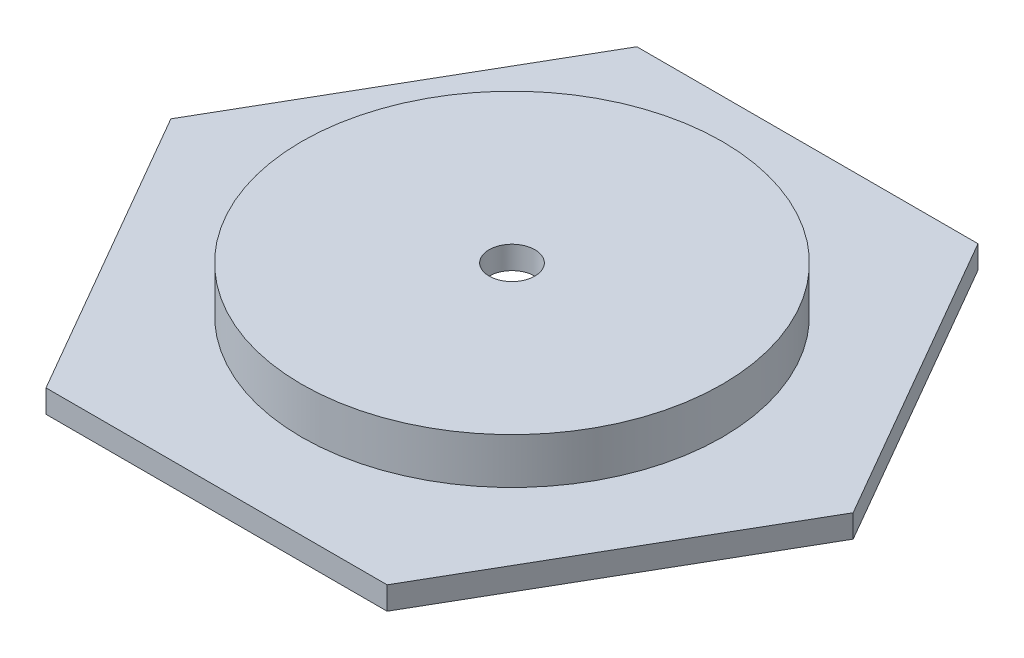
ISO-10303-21;
HEADER;
FILE_DESCRIPTION(('STEP AP214'),'2;1');
FILE_NAME('part.step','',(''),(''),'','','');
FILE_SCHEMA(('AUTOMOTIVE_DESIGN { 1 0 10303 214 1 1 1 1 }'));
ENDSEC;
DATA;
#1=APPLICATION_CONTEXT('core data for automotive mechanical design processes');
#2=APPLICATION_PROTOCOL_DEFINITION('international standard','automotive_design',2000,#1);
#3=PRODUCT_CONTEXT('',#1,'mechanical');
#4=PRODUCT('Part','Part','',(#3));
#5=PRODUCT_RELATED_PRODUCT_CATEGORY('part','',(#4));
#6=PRODUCT_DEFINITION_FORMATION('','',#4);
#7=PRODUCT_DEFINITION_CONTEXT('part definition',#1,'design');
#8=PRODUCT_DEFINITION('design','',#6,#7);
#9=PRODUCT_DEFINITION_SHAPE('','',#8);
#10=(LENGTH_UNIT() NAMED_UNIT(*) SI_UNIT(.MILLI.,.METRE.));
#11=(NAMED_UNIT(*) PLANE_ANGLE_UNIT() SI_UNIT($,.RADIAN.));
#12=(NAMED_UNIT(*) SI_UNIT($,.STERADIAN.) SOLID_ANGLE_UNIT());
#13=UNCERTAINTY_MEASURE_WITH_UNIT(LENGTH_MEASURE(1.E-05),#10,'distance_accuracy_value','');
#14=(GEOMETRIC_REPRESENTATION_CONTEXT(3) GLOBAL_UNCERTAINTY_ASSIGNED_CONTEXT((#13)) GLOBAL_UNIT_ASSIGNED_CONTEXT((#10,
#11,#12)) REPRESENTATION_CONTEXT('',''));
#15=CARTESIAN_POINT('',(0.,0.,0.));
#16=DIRECTION('',(0.,0.,1.));
#17=DIRECTION('',(1.,0.,0.));
#18=AXIS2_PLACEMENT_3D('',#15,#16,#17);
#19=CARTESIAN_POINT('',(18.6250000000003,2.5,32.2594462909701));
#20=DIRECTION('',(-0.866025403784442,0.,-0.499999999999995));
#21=DIRECTION('',(-0.499999999999995,0.,0.866025403784442));
#22=AXIS2_PLACEMENT_3D('',#19,#20,#21);
#23=PLANE('',#22);
#24=DIRECTION('',(0.499999999999995,0.,-0.866025403784442));
#25=VECTOR('',#24,1.);
#26=CARTESIAN_POINT('',(18.6250000000003,0.,32.2594462909701));
#27=LINE('',#26,#25);
#28=CARTESIAN_POINT('',(18.6250000000003,0.,32.2594462909701));
#29=VERTEX_POINT('',#28);
#30=CARTESIAN_POINT('',(37.2499999999999,0.,0.));
#31=VERTEX_POINT('',#30);
#32=EDGE_CURVE('E125',#29,#31,#27,.T.);
#33=ORIENTED_EDGE('',*,*,#32,.T.);
#34=DIRECTION('',(0.,-1.,0.));
#35=VECTOR('',#34,1.);
#36=CARTESIAN_POINT('',(37.2499999999999,2.5,0.));
#37=LINE('',#36,#35);
#38=CARTESIAN_POINT('',(37.2499999999999,2.5,0.));
#39=VERTEX_POINT('',#38);
#40=EDGE_CURVE('E42',#39,#31,#37,.T.);
#41=ORIENTED_EDGE('',*,*,#40,.F.);
#42=DIRECTION('',(0.499999999999995,0.,-0.866025403784442));
#43=VECTOR('',#42,1.);
#44=CARTESIAN_POINT('',(18.6250000000003,2.5,32.2594462909701));
#45=LINE('',#44,#43);
#46=CARTESIAN_POINT('',(18.6250000000003,2.5,32.2594462909701));
#47=VERTEX_POINT('',#46);
#48=EDGE_CURVE('E136',#47,#39,#45,.T.);
#49=ORIENTED_EDGE('',*,*,#48,.F.);
#50=DIRECTION('',(0.,-1.,0.));
#51=VECTOR('',#50,1.);
#52=CARTESIAN_POINT('',(18.6250000000003,2.5,32.2594462909701));
#53=LINE('',#52,#51);
#54=EDGE_CURVE('E121',#47,#29,#53,.T.);
#55=ORIENTED_EDGE('',*,*,#54,.T.);
#56=EDGE_LOOP('',(#33,#41,#49,#55));
#57=FACE_BOUND('',#56,.T.);
#58=ADVANCED_FACE('F39',(#57),#23,.F.);
#59=CARTESIAN_POINT('',(37.2499999999999,2.5,0.));
#60=DIRECTION('',(-0.866025403784438,0.,0.500000000000001));
#61=DIRECTION('',(0.500000000000001,0.,0.866025403784438));
#62=AXIS2_PLACEMENT_3D('',#59,#60,#61);
#63=PLANE('',#62);
#64=DIRECTION('',(-0.500000000000001,0.,-0.866025403784438));
#65=VECTOR('',#64,1.);
#66=CARTESIAN_POINT('',(37.2499999999999,0.,0.));
#67=LINE('',#66,#65);
#68=CARTESIAN_POINT('',(18.6249999999999,0.,-32.2594462909703));
#69=VERTEX_POINT('',#68);
#70=EDGE_CURVE('E128',#31,#69,#67,.T.);
#71=ORIENTED_EDGE('',*,*,#70,.T.);
#72=DIRECTION('',(0.,-1.,0.));
#73=VECTOR('',#72,1.);
#74=CARTESIAN_POINT('',(18.6249999999999,2.5,-32.2594462909703));
#75=LINE('',#74,#73);
#76=CARTESIAN_POINT('',(18.6249999999999,2.5,-32.2594462909703));
#77=VERTEX_POINT('',#76);
#78=EDGE_CURVE('E139',#77,#69,#75,.T.);
#79=ORIENTED_EDGE('',*,*,#78,.F.);
#80=DIRECTION('',(-0.500000000000001,0.,-0.866025403784438));
#81=VECTOR('',#80,1.);
#82=CARTESIAN_POINT('',(37.2499999999999,2.5,0.));
#83=LINE('',#82,#81);
#84=EDGE_CURVE('E94',#39,#77,#83,.T.);
#85=ORIENTED_EDGE('',*,*,#84,.F.);
#86=ORIENTED_EDGE('',*,*,#40,.T.);
#87=EDGE_LOOP('',(#71,#79,#85,#86));
#88=FACE_BOUND('',#87,.T.);
#89=ADVANCED_FACE('F144',(#88),#63,.F.);
#90=CARTESIAN_POINT('',(18.6249999999999,2.5,-32.2594462909703));
#91=DIRECTION('',(0.,0.,1.));
#92=DIRECTION('',(1.,0.,0.));
#93=AXIS2_PLACEMENT_3D('',#90,#91,#92);
#94=PLANE('',#93);
#95=DIRECTION('',(-1.,0.,0.));
#96=VECTOR('',#95,1.);
#97=CARTESIAN_POINT('',(18.6249999999999,0.,-32.2594462909703));
#98=LINE('',#97,#96);
#99=CARTESIAN_POINT('',(-18.6250000000001,0.,-32.2594462909702));
#100=VERTEX_POINT('',#99);
#101=EDGE_CURVE('E131',#69,#100,#98,.T.);
#102=ORIENTED_EDGE('',*,*,#101,.T.);
#103=DIRECTION('',(0.,-1.,0.));
#104=VECTOR('',#103,1.);
#105=CARTESIAN_POINT('',(-18.6250000000001,2.5,-32.2594462909702));
#106=LINE('',#105,#104);
#107=CARTESIAN_POINT('',(-18.6250000000001,2.5,-32.2594462909702));
#108=VERTEX_POINT('',#107);
#109=EDGE_CURVE('E116',#108,#100,#106,.T.);
#110=ORIENTED_EDGE('',*,*,#109,.F.);
#111=DIRECTION('',(-1.,0.,0.));
#112=VECTOR('',#111,1.);
#113=CARTESIAN_POINT('',(18.6249999999999,2.5,-32.2594462909703));
#114=LINE('',#113,#112);
#115=EDGE_CURVE('E107',#77,#108,#114,.T.);
#116=ORIENTED_EDGE('',*,*,#115,.F.);
#117=ORIENTED_EDGE('',*,*,#78,.T.);
#118=EDGE_LOOP('',(#102,#110,#116,#117));
#119=FACE_BOUND('',#118,.T.);
#120=ADVANCED_FACE('F150',(#119),#94,.F.);
#121=CARTESIAN_POINT('',(-18.6250000000001,2.5,-32.2594462909702));
#122=DIRECTION('',(0.866025403784442,0.,0.499999999999995));
#123=DIRECTION('',(0.499999999999995,0.,-0.866025403784442));
#124=AXIS2_PLACEMENT_3D('',#121,#122,#123);
#125=PLANE('',#124);
#126=DIRECTION('',(-0.499999999999995,0.,0.866025403784441));
#127=VECTOR('',#126,1.);
#128=CARTESIAN_POINT('',(-18.6250000000001,0.,-32.2594462909702));
#129=LINE('',#128,#127);
#130=CARTESIAN_POINT('',(-37.2499999999999,0.,2.60115359743813E-13));
#131=VERTEX_POINT('',#130);
#132=EDGE_CURVE('E115',#100,#131,#129,.T.);
#133=ORIENTED_EDGE('',*,*,#132,.T.);
#134=DIRECTION('',(0.,-1.,0.));
#135=VECTOR('',#134,1.);
#136=CARTESIAN_POINT('',(-37.2499999999999,2.5,2.60115359743813E-13));
#137=LINE('',#136,#135);
#138=CARTESIAN_POINT('',(-37.2499999999999,2.5,2.60115359743813E-13));
#139=VERTEX_POINT('',#138);
#140=EDGE_CURVE('E112',#139,#131,#137,.T.);
#141=ORIENTED_EDGE('',*,*,#140,.F.);
#142=DIRECTION('',(-0.499999999999995,0.,0.866025403784441));
#143=VECTOR('',#142,1.);
#144=CARTESIAN_POINT('',(-18.6250000000001,2.5,-32.2594462909702));
#145=LINE('',#144,#143);
#146=EDGE_CURVE('E101',#108,#139,#145,.T.);
#147=ORIENTED_EDGE('',*,*,#146,.F.);
#148=ORIENTED_EDGE('',*,*,#109,.T.);
#149=EDGE_LOOP('',(#133,#141,#147,#148));
#150=FACE_BOUND('',#149,.T.);
#151=ADVANCED_FACE('F113',(#150),#125,.F.);
#152=CARTESIAN_POINT('',(-37.2499999999999,2.5,2.60115359743813E-13));
#153=DIRECTION('',(0.866025403784434,0.,-0.500000000000007));
#154=DIRECTION('',(-0.500000000000007,0.,-0.866025403784435));
#155=AXIS2_PLACEMENT_3D('',#152,#153,#154);
#156=PLANE('',#155);
#157=DIRECTION('',(0.500000000000007,0.,0.866025403784434));
#158=VECTOR('',#157,1.);
#159=CARTESIAN_POINT('',(-37.2499999999999,0.,2.60115359743813E-13));
#160=LINE('',#159,#158);
#161=CARTESIAN_POINT('',(-18.6249999999997,0.,32.2594462909704));
#162=VERTEX_POINT('',#161);
#163=EDGE_CURVE('E79',#131,#162,#160,.T.);
#164=ORIENTED_EDGE('',*,*,#163,.T.);
#165=DIRECTION('',(0.,-1.,0.));
#166=VECTOR('',#165,1.);
#167=CARTESIAN_POINT('',(-18.6249999999997,2.5,32.2594462909704));
#168=LINE('',#167,#166);
#169=CARTESIAN_POINT('',(-18.6249999999997,2.5,32.2594462909704));
#170=VERTEX_POINT('',#169);
#171=EDGE_CURVE('E117',#170,#162,#168,.T.);
#172=ORIENTED_EDGE('',*,*,#171,.F.);
#173=DIRECTION('',(0.500000000000007,0.,0.866025403784434));
#174=VECTOR('',#173,1.);
#175=CARTESIAN_POINT('',(-37.2499999999999,2.5,2.60115359743813E-13));
#176=LINE('',#175,#174);
#177=EDGE_CURVE('E105',#139,#170,#176,.T.);
#178=ORIENTED_EDGE('',*,*,#177,.F.);
#179=ORIENTED_EDGE('',*,*,#140,.T.);
#180=EDGE_LOOP('',(#164,#172,#178,#179));
#181=FACE_BOUND('',#180,.T.);
#182=ADVANCED_FACE('F119',(#181),#156,.F.);
#183=CARTESIAN_POINT('',(-18.6249999999997,2.5,32.2594462909704));
#184=DIRECTION('',(0.,0.,-1.));
#185=DIRECTION('',(-1.,0.,0.));
#186=AXIS2_PLACEMENT_3D('',#183,#184,#185);
#187=PLANE('',#186);
#188=DIRECTION('',(1.,0.,0.));
#189=VECTOR('',#188,1.);
#190=CARTESIAN_POINT('',(-18.6249999999997,0.,32.2594462909704));
#191=LINE('',#190,#189);
#192=EDGE_CURVE('E85',#162,#29,#191,.T.);
#193=ORIENTED_EDGE('',*,*,#192,.T.);
#194=ORIENTED_EDGE('',*,*,#54,.F.);
#195=DIRECTION('',(1.,0.,0.));
#196=VECTOR('',#195,1.);
#197=CARTESIAN_POINT('',(-18.6249999999997,2.5,32.2594462909704));
#198=LINE('',#197,#196);
#199=EDGE_CURVE('E56',#170,#47,#198,.T.);
#200=ORIENTED_EDGE('',*,*,#199,.F.);
#201=ORIENTED_EDGE('',*,*,#171,.T.);
#202=EDGE_LOOP('',(#193,#194,#200,#201));
#203=FACE_BOUND('',#202,.T.);
#204=ADVANCED_FACE('F193',(#203),#187,.F.);
#205=CARTESIAN_POINT('',(0.,2.5,0.));
#206=DIRECTION('',(0.,1.,0.));
#207=DIRECTION('',(0.,0.,1.));
#208=AXIS2_PLACEMENT_3D('',#205,#206,#207);
#209=PLANE('',#208);
#210=CARTESIAN_POINT('',(0.,2.5,0.));
#211=DIRECTION('',(0.,1.,0.));
#212=DIRECTION('',(0.,0.,1.));
#213=AXIS2_PLACEMENT_3D('',#210,#211,#212);
#214=CIRCLE('',#213,22.96682838647);
#215=CARTESIAN_POINT('',(0.,2.5,22.96682838647));
#216=VERTEX_POINT('',#215);
#217=EDGE_CURVE('E11',#216,#216,#214,.T.);
#218=ORIENTED_EDGE('',*,*,#217,.F.);
#219=EDGE_LOOP('',(#218));
#220=FACE_BOUND('',#219,.T.);
#221=ORIENTED_EDGE('',*,*,#48,.T.);
#222=ORIENTED_EDGE('',*,*,#84,.T.);
#223=ORIENTED_EDGE('',*,*,#115,.T.);
#224=ORIENTED_EDGE('',*,*,#146,.T.);
#225=ORIENTED_EDGE('',*,*,#177,.T.);
#226=ORIENTED_EDGE('',*,*,#199,.T.);
#227=EDGE_LOOP('',(#221,#222,#223,#224,#225,#226));
#228=FACE_BOUND('',#227,.T.);
#229=ADVANCED_FACE('F103',(#220,#228),#209,.T.);
#230=CARTESIAN_POINT('',(0.,0.,0.));
#231=DIRECTION('',(0.,1.,0.));
#232=DIRECTION('',(0.,0.,1.));
#233=AXIS2_PLACEMENT_3D('',#230,#231,#232);
#234=PLANE('',#233);
#235=CARTESIAN_POINT('',(0.,0.,0.));
#236=DIRECTION('',(0.,-1.,0.));
#237=DIRECTION('',(0.,0.,-1.));
#238=AXIS2_PLACEMENT_3D('',#235,#236,#237);
#239=CIRCLE('',#238,20.8266167420649);
#240=CARTESIAN_POINT('',(0.,0.,-20.8266167420649));
#241=VERTEX_POINT('',#240);
#242=EDGE_CURVE('E157',#241,#241,#239,.T.);
#243=ORIENTED_EDGE('',*,*,#242,.F.);
#244=EDGE_LOOP('',(#243));
#245=FACE_BOUND('',#244,.T.);
#246=ORIENTED_EDGE('',*,*,#32,.F.);
#247=ORIENTED_EDGE('',*,*,#192,.F.);
#248=ORIENTED_EDGE('',*,*,#163,.F.);
#249=ORIENTED_EDGE('',*,*,#132,.F.);
#250=ORIENTED_EDGE('',*,*,#101,.F.);
#251=ORIENTED_EDGE('',*,*,#70,.F.);
#252=EDGE_LOOP('',(#246,#247,#248,#249,#250,#251));
#253=FACE_BOUND('',#252,.T.);
#254=ADVANCED_FACE('F149',(#245,#253),#234,.F.);
#255=CARTESIAN_POINT('',(0.,7.5,0.));
#256=DIRECTION('',(0.,1.,0.));
#257=DIRECTION('',(0.,0.,1.));
#258=AXIS2_PLACEMENT_3D('',#255,#256,#257);
#259=PLANE('',#258);
#260=CARTESIAN_POINT('',(0.,7.5,0.));
#261=DIRECTION('',(0.,1.,0.));
#262=DIRECTION('',(0.,0.,1.));
#263=AXIS2_PLACEMENT_3D('',#260,#261,#262);
#264=CIRCLE('',#263,2.5);
#265=CARTESIAN_POINT('',(0.,7.5,2.5));
#266=VERTEX_POINT('',#265);
#267=EDGE_CURVE('E160',#266,#266,#264,.T.);
#268=ORIENTED_EDGE('',*,*,#267,.F.);
#269=EDGE_LOOP('',(#268));
#270=FACE_BOUND('',#269,.T.);
#271=CARTESIAN_POINT('',(0.,7.5,0.));
#272=DIRECTION('',(0.,1.,0.));
#273=DIRECTION('',(0.,0.,1.));
#274=AXIS2_PLACEMENT_3D('',#271,#272,#273);
#275=CIRCLE('',#274,22.96682838647);
#276=CARTESIAN_POINT('',(0.,7.5,22.96682838647));
#277=VERTEX_POINT('',#276);
#278=EDGE_CURVE('E129',#277,#277,#275,.T.);
#279=ORIENTED_EDGE('',*,*,#278,.T.);
#280=EDGE_LOOP('',(#279));
#281=FACE_BOUND('',#280,.T.);
#282=ADVANCED_FACE('F185',(#270,#281),#259,.T.);
#283=CARTESIAN_POINT('',(0.,7.5,0.));
#284=DIRECTION('',(0.,-1.,0.));
#285=DIRECTION('',(0.,0.,-1.));
#286=AXIS2_PLACEMENT_3D('',#283,#284,#285);
#287=CYLINDRICAL_SURFACE('',#286,22.96682838647);
#288=ORIENTED_EDGE('',*,*,#278,.F.);
#289=EDGE_LOOP('',(#288));
#290=FACE_BOUND('',#289,.T.);
#291=ORIENTED_EDGE('',*,*,#217,.T.);
#292=EDGE_LOOP('',(#291));
#293=FACE_BOUND('',#292,.T.);
#294=ADVANCED_FACE('F180',(#290,#293),#287,.T.);
#295=CARTESIAN_POINT('',(0.,5.,0.));
#296=DIRECTION('',(0.,-1.,0.));
#297=DIRECTION('',(0.,0.,-1.));
#298=AXIS2_PLACEMENT_3D('',#295,#296,#297);
#299=CYLINDRICAL_SURFACE('',#298,20.8266167420649);
#300=CARTESIAN_POINT('',(0.,5.,0.));
#301=DIRECTION('',(0.,-1.,0.));
#302=DIRECTION('',(0.,0.,-1.));
#303=AXIS2_PLACEMENT_3D('',#300,#301,#302);
#304=CIRCLE('',#303,20.8266167420649);
#305=CARTESIAN_POINT('',(0.,5.,-20.8266167420649));
#306=VERTEX_POINT('',#305);
#307=EDGE_CURVE('E156',#306,#306,#304,.T.);
#308=ORIENTED_EDGE('',*,*,#307,.F.);
#309=EDGE_LOOP('',(#308));
#310=FACE_BOUND('',#309,.T.);
#311=ORIENTED_EDGE('',*,*,#242,.T.);
#312=EDGE_LOOP('',(#311));
#313=FACE_BOUND('',#312,.T.);
#314=ADVANCED_FACE('F174',(#310,#313),#299,.F.);
#315=CARTESIAN_POINT('',(0.,5.,0.));
#316=DIRECTION('',(0.,-1.,0.));
#317=DIRECTION('',(0.,0.,-1.));
#318=AXIS2_PLACEMENT_3D('',#315,#316,#317);
#319=PLANE('',#318);
#320=CARTESIAN_POINT('',(0.,5.,0.));
#321=DIRECTION('',(0.,-1.,0.));
#322=DIRECTION('',(0.,0.,-1.));
#323=AXIS2_PLACEMENT_3D('',#320,#321,#322);
#324=CIRCLE('',#323,2.5);
#325=CARTESIAN_POINT('',(0.,5.,-2.5));
#326=VERTEX_POINT('',#325);
#327=EDGE_CURVE('E165',#326,#326,#324,.T.);
#328=ORIENTED_EDGE('',*,*,#327,.F.);
#329=EDGE_LOOP('',(#328));
#330=FACE_BOUND('',#329,.T.);
#331=ORIENTED_EDGE('',*,*,#307,.T.);
#332=EDGE_LOOP('',(#331));
#333=FACE_BOUND('',#332,.T.);
#334=ADVANCED_FACE('F171',(#330,#333),#319,.T.);
#335=CARTESIAN_POINT('',(0.,10.,0.));
#336=DIRECTION('',(0.,-1.,0.));
#337=DIRECTION('',(0.,0.,-1.));
#338=AXIS2_PLACEMENT_3D('',#335,#336,#337);
#339=CYLINDRICAL_SURFACE('',#338,2.5);
#340=ORIENTED_EDGE('',*,*,#267,.T.);
#341=EDGE_LOOP('',(#340));
#342=FACE_BOUND('',#341,.T.);
#343=ORIENTED_EDGE('',*,*,#327,.T.);
#344=EDGE_LOOP('',(#343));
#345=FACE_BOUND('',#344,.T.);
#346=ADVANCED_FACE('F169',(#342,#345),#339,.F.);
#347=CLOSED_SHELL('',(#58,#89,#120,#151,#182,#204,#229,#254,#282,#294,#314,#334,#346));
#348=MANIFOLD_SOLID_BREP('B2',#347);
#349=ADVANCED_BREP_SHAPE_REPRESENTATION('',(#18,#348),#14);
#350=SHAPE_DEFINITION_REPRESENTATION(#9,#349);
ENDSEC;
END-ISO-10303-21;
